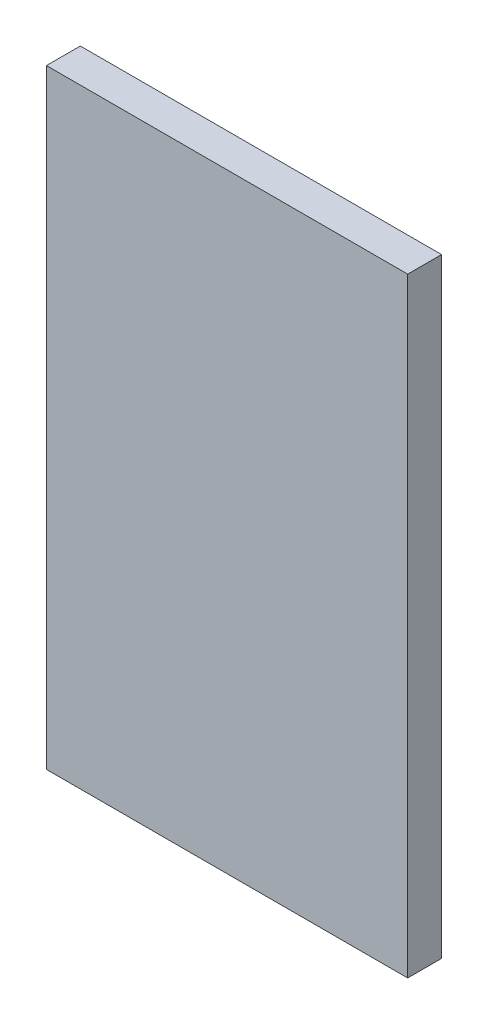
ISO-10303-21;
HEADER;
FILE_DESCRIPTION(('STEP AP214'),'2;1');
FILE_NAME('part.step','',(''),(''),'','','');
FILE_SCHEMA(('AUTOMOTIVE_DESIGN { 1 0 10303 214 1 1 1 1 }'));
ENDSEC;
DATA;
#1=APPLICATION_CONTEXT('core data for automotive mechanical design processes');
#2=APPLICATION_PROTOCOL_DEFINITION('international standard','automotive_design',2000,#1);
#3=PRODUCT_CONTEXT('',#1,'mechanical');
#4=PRODUCT('Part','Part','',(#3));
#5=PRODUCT_RELATED_PRODUCT_CATEGORY('part','',(#4));
#6=PRODUCT_DEFINITION_FORMATION('','',#4);
#7=PRODUCT_DEFINITION_CONTEXT('part definition',#1,'design');
#8=PRODUCT_DEFINITION('design','',#6,#7);
#9=PRODUCT_DEFINITION_SHAPE('','',#8);
#10=(LENGTH_UNIT() NAMED_UNIT(*) SI_UNIT(.MILLI.,.METRE.));
#11=(NAMED_UNIT(*) PLANE_ANGLE_UNIT() SI_UNIT($,.RADIAN.));
#12=(NAMED_UNIT(*) SI_UNIT($,.STERADIAN.) SOLID_ANGLE_UNIT());
#13=UNCERTAINTY_MEASURE_WITH_UNIT(LENGTH_MEASURE(1.E-05),#10,'distance_accuracy_value','');
#14=(GEOMETRIC_REPRESENTATION_CONTEXT(3) GLOBAL_UNCERTAINTY_ASSIGNED_CONTEXT((#13)) GLOBAL_UNIT_ASSIGNED_CONTEXT((#10,
#11,#12)) REPRESENTATION_CONTEXT('',''));
#15=CARTESIAN_POINT('',(0.,0.,0.));
#16=DIRECTION('',(0.,0.,1.));
#17=DIRECTION('',(1.,0.,0.));
#18=AXIS2_PLACEMENT_3D('',#15,#16,#17);
#19=CARTESIAN_POINT('',(101.6,171.45,19.05));
#20=DIRECTION('',(-1.,0.,0.));
#21=DIRECTION('',(0.,-1.,0.));
#22=AXIS2_PLACEMENT_3D('',#19,#20,#21);
#23=PLANE('',#22);
#24=DIRECTION('',(0.,1.,0.));
#25=VECTOR('',#24,1.);
#26=CARTESIAN_POINT('',(101.6,171.45,0.));
#27=LINE('',#26,#25);
#28=CARTESIAN_POINT('',(101.6,-171.45,0.));
#29=VERTEX_POINT('',#28);
#30=CARTESIAN_POINT('',(101.6,171.45,0.));
#31=VERTEX_POINT('',#30);
#32=EDGE_CURVE('E107',#29,#31,#27,.T.);
#33=ORIENTED_EDGE('',*,*,#32,.T.);
#34=DIRECTION('',(0.,0.,-1.));
#35=VECTOR('',#34,1.);
#36=CARTESIAN_POINT('',(101.6,171.45,19.05));
#37=LINE('',#36,#35);
#38=CARTESIAN_POINT('',(101.6,171.45,19.05));
#39=VERTEX_POINT('',#38);
#40=EDGE_CURVE('E11',#39,#31,#37,.T.);
#41=ORIENTED_EDGE('',*,*,#40,.F.);
#42=DIRECTION('',(0.,1.,0.));
#43=VECTOR('',#42,1.);
#44=CARTESIAN_POINT('',(101.6,171.45,19.05));
#45=LINE('',#44,#43);
#46=CARTESIAN_POINT('',(101.6,-171.45,19.05));
#47=VERTEX_POINT('',#46);
#48=EDGE_CURVE('E91',#47,#39,#45,.T.);
#49=ORIENTED_EDGE('',*,*,#48,.F.);
#50=DIRECTION('',(0.,0.,-1.));
#51=VECTOR('',#50,1.);
#52=CARTESIAN_POINT('',(101.6,-171.45,19.05));
#53=LINE('',#52,#51);
#54=EDGE_CURVE('E103',#47,#29,#53,.T.);
#55=ORIENTED_EDGE('',*,*,#54,.T.);
#56=EDGE_LOOP('',(#33,#41,#49,#55));
#57=FACE_BOUND('',#56,.T.);
#58=ADVANCED_FACE('F39',(#57),#23,.F.);
#59=CARTESIAN_POINT('',(-101.6,171.45,19.05));
#60=DIRECTION('',(0.,-1.,0.));
#61=DIRECTION('',(0.,0.,-1.));
#62=AXIS2_PLACEMENT_3D('',#59,#60,#61);
#63=PLANE('',#62);
#64=DIRECTION('',(-1.,0.,0.));
#65=VECTOR('',#64,1.);
#66=CARTESIAN_POINT('',(-101.6,171.45,0.));
#67=LINE('',#66,#65);
#68=CARTESIAN_POINT('',(-101.6,171.45,0.));
#69=VERTEX_POINT('',#68);
#70=EDGE_CURVE('E96',#31,#69,#67,.T.);
#71=ORIENTED_EDGE('',*,*,#70,.T.);
#72=DIRECTION('',(0.,0.,-1.));
#73=VECTOR('',#72,1.);
#74=CARTESIAN_POINT('',(-101.6,171.45,19.05));
#75=LINE('',#74,#73);
#76=CARTESIAN_POINT('',(-101.6,171.45,19.05));
#77=VERTEX_POINT('',#76);
#78=EDGE_CURVE('E48',#77,#69,#75,.T.);
#79=ORIENTED_EDGE('',*,*,#78,.F.);
#80=DIRECTION('',(-1.,0.,0.));
#81=VECTOR('',#80,1.);
#82=CARTESIAN_POINT('',(-101.6,171.45,19.05));
#83=LINE('',#82,#81);
#84=EDGE_CURVE('E86',#39,#77,#83,.T.);
#85=ORIENTED_EDGE('',*,*,#84,.F.);
#86=ORIENTED_EDGE('',*,*,#40,.T.);
#87=EDGE_LOOP('',(#71,#79,#85,#86));
#88=FACE_BOUND('',#87,.T.);
#89=ADVANCED_FACE('F95',(#88),#63,.F.);
#90=CARTESIAN_POINT('',(-101.6,171.45,19.05));
#91=DIRECTION('',(1.,0.,0.));
#92=DIRECTION('',(0.,1.,0.));
#93=AXIS2_PLACEMENT_3D('',#90,#91,#92);
#94=PLANE('',#93);
#95=DIRECTION('',(0.,-1.,0.));
#96=VECTOR('',#95,1.);
#97=CARTESIAN_POINT('',(-101.6,171.45,0.));
#98=LINE('',#97,#96);
#99=CARTESIAN_POINT('',(-101.6,-171.45,0.));
#100=VERTEX_POINT('',#99);
#101=EDGE_CURVE('E73',#69,#100,#98,.T.);
#102=ORIENTED_EDGE('',*,*,#101,.T.);
#103=DIRECTION('',(0.,0.,-1.));
#104=VECTOR('',#103,1.);
#105=CARTESIAN_POINT('',(-101.6,-171.45,19.05));
#106=LINE('',#105,#104);
#107=CARTESIAN_POINT('',(-101.6,-171.45,19.05));
#108=VERTEX_POINT('',#107);
#109=EDGE_CURVE('E98',#108,#100,#106,.T.);
#110=ORIENTED_EDGE('',*,*,#109,.F.);
#111=DIRECTION('',(0.,-1.,0.));
#112=VECTOR('',#111,1.);
#113=CARTESIAN_POINT('',(-101.6,171.45,19.05));
#114=LINE('',#113,#112);
#115=EDGE_CURVE('E89',#77,#108,#114,.T.);
#116=ORIENTED_EDGE('',*,*,#115,.F.);
#117=ORIENTED_EDGE('',*,*,#78,.T.);
#118=EDGE_LOOP('',(#102,#110,#116,#117));
#119=FACE_BOUND('',#118,.T.);
#120=ADVANCED_FACE('F99',(#119),#94,.F.);
#121=CARTESIAN_POINT('',(-101.6,-171.45,19.05));
#122=DIRECTION('',(0.,1.,0.));
#123=DIRECTION('',(0.,0.,1.));
#124=AXIS2_PLACEMENT_3D('',#121,#122,#123);
#125=PLANE('',#124);
#126=DIRECTION('',(1.,0.,0.));
#127=VECTOR('',#126,1.);
#128=CARTESIAN_POINT('',(-101.6,-171.45,0.));
#129=LINE('',#128,#127);
#130=EDGE_CURVE('E79',#100,#29,#129,.T.);
#131=ORIENTED_EDGE('',*,*,#130,.T.);
#132=ORIENTED_EDGE('',*,*,#54,.F.);
#133=DIRECTION('',(1.,0.,0.));
#134=VECTOR('',#133,1.);
#135=CARTESIAN_POINT('',(-101.6,-171.45,19.05));
#136=LINE('',#135,#134);
#137=EDGE_CURVE('E56',#108,#47,#136,.T.);
#138=ORIENTED_EDGE('',*,*,#137,.F.);
#139=ORIENTED_EDGE('',*,*,#109,.T.);
#140=EDGE_LOOP('',(#131,#132,#138,#139));
#141=FACE_BOUND('',#140,.T.);
#142=ADVANCED_FACE('F120',(#141),#125,.F.);
#143=CARTESIAN_POINT('',(0.,0.,19.05));
#144=DIRECTION('',(0.,0.,1.));
#145=DIRECTION('',(1.,0.,0.));
#146=AXIS2_PLACEMENT_3D('',#143,#144,#145);
#147=PLANE('',#146);
#148=ORIENTED_EDGE('',*,*,#48,.T.);
#149=ORIENTED_EDGE('',*,*,#84,.T.);
#150=ORIENTED_EDGE('',*,*,#115,.T.);
#151=ORIENTED_EDGE('',*,*,#137,.T.);
#152=EDGE_LOOP('',(#148,#149,#150,#151));
#153=FACE_BOUND('',#152,.T.);
#154=ADVANCED_FACE('F87',(#153),#147,.T.);
#155=CARTESIAN_POINT('',(0.,0.,0.));
#156=DIRECTION('',(0.,0.,1.));
#157=DIRECTION('',(1.,0.,0.));
#158=AXIS2_PLACEMENT_3D('',#155,#156,#157);
#159=PLANE('',#158);
#160=ORIENTED_EDGE('',*,*,#32,.F.);
#161=ORIENTED_EDGE('',*,*,#130,.F.);
#162=ORIENTED_EDGE('',*,*,#101,.F.);
#163=ORIENTED_EDGE('',*,*,#70,.F.);
#164=EDGE_LOOP('',(#160,#161,#162,#163));
#165=FACE_BOUND('',#164,.T.);
#166=ADVANCED_FACE('F123',(#165),#159,.F.);
#167=CLOSED_SHELL('',(#58,#89,#120,#142,#154,#166));
#168=MANIFOLD_SOLID_BREP('B2',#167);
#169=ADVANCED_BREP_SHAPE_REPRESENTATION('',(#18,#168),#14);
#170=SHAPE_DEFINITION_REPRESENTATION(#9,#169);
ENDSEC;
END-ISO-10303-21;
